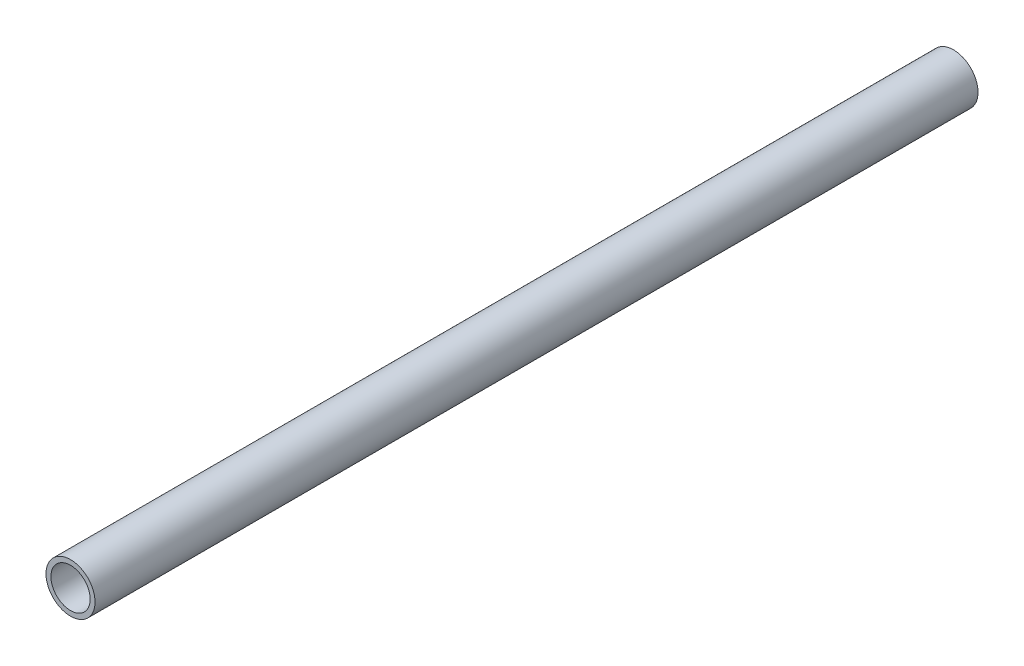
ISO-10303-21;
HEADER;
FILE_DESCRIPTION(('STEP AP214'),'2;1');
FILE_NAME('part.step','',(''),(''),'','','');
FILE_SCHEMA(('AUTOMOTIVE_DESIGN { 1 0 10303 214 1 1 1 1 }'));
ENDSEC;
DATA;
#1=APPLICATION_CONTEXT('core data for automotive mechanical design processes');
#2=APPLICATION_PROTOCOL_DEFINITION('international standard','automotive_design',2000,#1);
#3=PRODUCT_CONTEXT('',#1,'mechanical');
#4=PRODUCT('Part','Part','',(#3));
#5=PRODUCT_RELATED_PRODUCT_CATEGORY('part','',(#4));
#6=PRODUCT_DEFINITION_FORMATION('','',#4);
#7=PRODUCT_DEFINITION_CONTEXT('part definition',#1,'design');
#8=PRODUCT_DEFINITION('design','',#6,#7);
#9=PRODUCT_DEFINITION_SHAPE('','',#8);
#10=(LENGTH_UNIT() NAMED_UNIT(*) SI_UNIT(.MILLI.,.METRE.));
#11=(NAMED_UNIT(*) PLANE_ANGLE_UNIT() SI_UNIT($,.RADIAN.));
#12=(NAMED_UNIT(*) SI_UNIT($,.STERADIAN.) SOLID_ANGLE_UNIT());
#13=UNCERTAINTY_MEASURE_WITH_UNIT(LENGTH_MEASURE(1.E-05),#10,'distance_accuracy_value','');
#14=(GEOMETRIC_REPRESENTATION_CONTEXT(3) GLOBAL_UNCERTAINTY_ASSIGNED_CONTEXT((#13)) GLOBAL_UNIT_ASSIGNED_CONTEXT((#10,
#11,#12)) REPRESENTATION_CONTEXT('',''));
#15=CARTESIAN_POINT('',(0.,0.,0.));
#16=DIRECTION('',(0.,0.,1.));
#17=DIRECTION('',(1.,0.,0.));
#18=AXIS2_PLACEMENT_3D('',#15,#16,#17);
#19=CARTESIAN_POINT('',(0.,0.,0.));
#20=DIRECTION('',(0.,0.,1.));
#21=DIRECTION('',(1.,0.,0.));
#22=AXIS2_PLACEMENT_3D('',#19,#20,#21);
#23=CYLINDRICAL_SURFACE('',#22,2.);
#24=CARTESIAN_POINT('',(0.,0.,0.));
#25=DIRECTION('',(0.,0.,-1.));
#26=DIRECTION('',(1.,0.,0.));
#27=AXIS2_PLACEMENT_3D('',#24,#25,#26);
#28=CIRCLE('',#27,2.);
#29=CARTESIAN_POINT('',(-2.,0.,0.));
#30=VERTEX_POINT('',#29);
#31=EDGE_CURVE('E20',#30,#30,#28,.T.);
#32=ORIENTED_EDGE('',*,*,#31,.T.);
#33=DIRECTION('',(0.,0.,1.));
#34=VECTOR('',#33,1.);
#35=CARTESIAN_POINT('',(-2.,0.,0.));
#36=LINE('',#35,#34);
#37=CARTESIAN_POINT('',(-2.,0.,90.));
#38=VERTEX_POINT('',#37);
#39=EDGE_CURVE('E11',#30,#38,#36,.T.);
#40=ORIENTED_EDGE('',*,*,#39,.T.);
#41=CARTESIAN_POINT('',(0.,0.,90.));
#42=DIRECTION('',(0.,0.,-1.));
#43=DIRECTION('',(1.,0.,0.));
#44=AXIS2_PLACEMENT_3D('',#41,#42,#43);
#45=CIRCLE('',#44,2.);
#46=EDGE_CURVE('E27',#38,#38,#45,.T.);
#47=ORIENTED_EDGE('',*,*,#46,.F.);
#48=ORIENTED_EDGE('',*,*,#39,.F.);
#49=EDGE_LOOP('',(#32,#40,#47,#48));
#50=FACE_BOUND('',#49,.T.);
#51=ADVANCED_FACE('F17',(#50),#23,.F.);
#52=CARTESIAN_POINT('',(0.,0.,90.));
#53=DIRECTION('',(0.,0.,1.));
#54=DIRECTION('',(1.,0.,0.));
#55=AXIS2_PLACEMENT_3D('',#52,#53,#54);
#56=PLANE('',#55);
#57=ORIENTED_EDGE('',*,*,#46,.T.);
#58=EDGE_LOOP('',(#57));
#59=FACE_BOUND('',#58,.T.);
#60=CARTESIAN_POINT('',(0.,0.,90.));
#61=DIRECTION('',(0.,0.,1.));
#62=DIRECTION('',(1.,0.,0.));
#63=AXIS2_PLACEMENT_3D('',#60,#61,#62);
#64=CIRCLE('',#63,2.5);
#65=CARTESIAN_POINT('',(-2.5,0.,90.));
#66=VERTEX_POINT('',#65);
#67=EDGE_CURVE('E62',#66,#66,#64,.T.);
#68=ORIENTED_EDGE('',*,*,#67,.T.);
#69=EDGE_LOOP('',(#68));
#70=FACE_BOUND('',#69,.T.);
#71=ADVANCED_FACE('F78',(#59,#70),#56,.T.);
#72=CARTESIAN_POINT('',(0.,0.,0.));
#73=DIRECTION('',(0.,0.,1.));
#74=DIRECTION('',(1.,0.,0.));
#75=AXIS2_PLACEMENT_3D('',#72,#73,#74);
#76=CYLINDRICAL_SURFACE('',#75,2.5);
#77=ORIENTED_EDGE('',*,*,#67,.F.);
#78=DIRECTION('',(0.,0.,-1.));
#79=VECTOR('',#78,1.);
#80=CARTESIAN_POINT('',(-2.5,0.,0.));
#81=LINE('',#80,#79);
#82=CARTESIAN_POINT('',(-2.5,0.,0.));
#83=VERTEX_POINT('',#82);
#84=EDGE_CURVE('E50',#66,#83,#81,.T.);
#85=ORIENTED_EDGE('',*,*,#84,.T.);
#86=CARTESIAN_POINT('',(0.,0.,0.));
#87=DIRECTION('',(0.,0.,1.));
#88=DIRECTION('',(1.,0.,0.));
#89=AXIS2_PLACEMENT_3D('',#86,#87,#88);
#90=CIRCLE('',#89,2.5);
#91=EDGE_CURVE('E65',#83,#83,#90,.T.);
#92=ORIENTED_EDGE('',*,*,#91,.T.);
#93=ORIENTED_EDGE('',*,*,#84,.F.);
#94=EDGE_LOOP('',(#77,#85,#92,#93));
#95=FACE_BOUND('',#94,.T.);
#96=ADVANCED_FACE('F79',(#95),#76,.T.);
#97=CARTESIAN_POINT('',(0.,0.,0.));
#98=DIRECTION('',(0.,0.,1.));
#99=DIRECTION('',(1.,0.,0.));
#100=AXIS2_PLACEMENT_3D('',#97,#98,#99);
#101=PLANE('',#100);
#102=ORIENTED_EDGE('',*,*,#31,.F.);
#103=EDGE_LOOP('',(#102));
#104=FACE_BOUND('',#103,.T.);
#105=ORIENTED_EDGE('',*,*,#91,.F.);
#106=EDGE_LOOP('',(#105));
#107=FACE_BOUND('',#106,.T.);
#108=ADVANCED_FACE('F81',(#104,#107),#101,.F.);
#109=CLOSED_SHELL('',(#51,#71,#96,#108));
#110=MANIFOLD_SOLID_BREP('B1',#109);
#111=ADVANCED_BREP_SHAPE_REPRESENTATION('',(#18,#110),#14);
#112=SHAPE_DEFINITION_REPRESENTATION(#9,#111);
ENDSEC;
END-ISO-10303-21;
